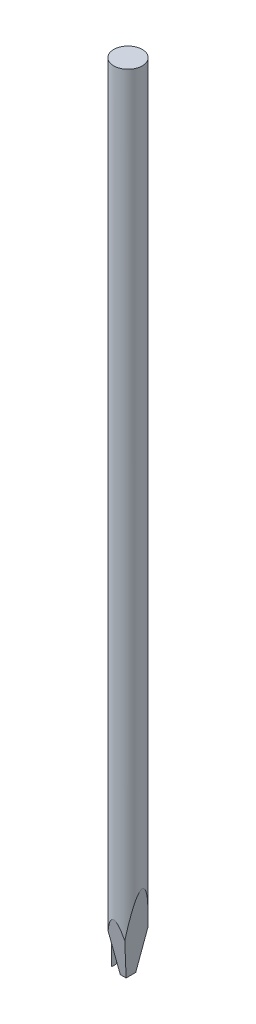
ISO-10303-21;
HEADER;
FILE_DESCRIPTION(('STEP AP214'),'2;1');
FILE_NAME('part.step','',(''),(''),'','','');
FILE_SCHEMA(('AUTOMOTIVE_DESIGN { 1 0 10303 214 1 1 1 1 }'));
ENDSEC;
DATA;
#1=APPLICATION_CONTEXT('core data for automotive mechanical design processes');
#2=APPLICATION_PROTOCOL_DEFINITION('international standard','automotive_design',2000,#1);
#3=PRODUCT_CONTEXT('',#1,'mechanical');
#4=PRODUCT('Part','Part','',(#3));
#5=PRODUCT_RELATED_PRODUCT_CATEGORY('part','',(#4));
#6=PRODUCT_DEFINITION_FORMATION('','',#4);
#7=PRODUCT_DEFINITION_CONTEXT('part definition',#1,'design');
#8=PRODUCT_DEFINITION('design','',#6,#7);
#9=PRODUCT_DEFINITION_SHAPE('','',#8);
#10=(LENGTH_UNIT() NAMED_UNIT(*) SI_UNIT(.MILLI.,.METRE.));
#11=(NAMED_UNIT(*) PLANE_ANGLE_UNIT() SI_UNIT($,.RADIAN.));
#12=(NAMED_UNIT(*) SI_UNIT($,.STERADIAN.) SOLID_ANGLE_UNIT());
#13=UNCERTAINTY_MEASURE_WITH_UNIT(LENGTH_MEASURE(1.E-05),#10,'distance_accuracy_value','');
#14=(GEOMETRIC_REPRESENTATION_CONTEXT(3) GLOBAL_UNCERTAINTY_ASSIGNED_CONTEXT((#13)) GLOBAL_UNIT_ASSIGNED_CONTEXT((#10,
#11,#12)) REPRESENTATION_CONTEXT('',''));
#15=CARTESIAN_POINT('',(0.,0.,0.));
#16=DIRECTION('',(0.,0.,1.));
#17=DIRECTION('',(1.,0.,0.));
#18=AXIS2_PLACEMENT_3D('',#15,#16,#17);
#19=CARTESIAN_POINT('',(0.,75.9968,0.));
#20=DIRECTION('',(0.,-1.,0.));
#21=DIRECTION('',(0.,0.,-1.));
#22=AXIS2_PLACEMENT_3D('',#19,#20,#21);
#23=CYLINDRICAL_SURFACE('',#22,1.35001);
#24=CARTESIAN_POINT('',(0.,75.9968,0.));
#25=DIRECTION('',(0.,1.,0.));
#26=DIRECTION('',(0.,0.,1.));
#27=AXIS2_PLACEMENT_3D('',#24,#25,#26);
#28=CIRCLE('',#27,1.35001);
#29=CARTESIAN_POINT('',(0.,75.9968,1.35001));
#30=VERTEX_POINT('',#29);
#31=EDGE_CURVE('E109',#30,#30,#28,.T.);
#32=ORIENTED_EDGE('',*,*,#31,.F.);
#33=EDGE_LOOP('',(#32));
#34=FACE_BOUND('',#33,.T.);
#35=CARTESIAN_POINT('',(0.,0.879000020000006,0.));
#36=DIRECTION('',(0.,-1.,0.));
#37=DIRECTION('',(1.,0.,0.));
#38=AXIS2_PLACEMENT_3D('',#35,#36,#37);
#39=CIRCLE('',#38,1.35001);
#40=CARTESIAN_POINT('',(-1.32842,0.87900002,0.240473083109109));
#41=VERTEX_POINT('',#40);
#42=CARTESIAN_POINT('',(-1.32842,0.87900002,-0.240473083109109));
#43=VERTEX_POINT('',#42);
#44=EDGE_CURVE('E11',#41,#43,#39,.T.);
#45=ORIENTED_EDGE('',*,*,#44,.F.);
#46=DIRECTION('',(0.,-1.,0.));
#47=VECTOR('',#46,1.);
#48=CARTESIAN_POINT('',(-1.32842,75.9968,0.240473083109109));
#49=LINE('',#48,#47);
#50=CARTESIAN_POINT('',(-1.32842,8.36957730255488,0.240473083109109));
#51=VERTEX_POINT('',#50);
#52=EDGE_CURVE('E48',#51,#41,#49,.T.);
#53=ORIENTED_EDGE('',*,*,#52,.F.);
#54=CARTESIAN_POINT('',(0.,-1.0826221440547,0.));
#55=DIRECTION('',(-0.99026806874157,-0.139173100960066,0.));
#56=DIRECTION('',(0.139173100960066,-0.99026806874157,0.));
#57=AXIS2_PLACEMENT_3D('',#54,#55,#56);
#58=ELLIPSE('',#57,9.70022217430774,1.35001);
#59=CARTESIAN_POINT('',(-0.787337652322436,4.51957634857339,1.09664325162534));
#60=VERTEX_POINT('',#59);
#61=EDGE_CURVE('E130',#60,#51,#58,.T.);
#62=ORIENTED_EDGE('',*,*,#61,.F.);
#63=CARTESIAN_POINT('',(0.,-1.6997965869758,0.));
#64=DIRECTION('',(0.,-0.173648177666931,0.984807753012208));
#65=DIRECTION('',(0.,-0.984807753012208,-0.173648177666931));
#66=AXIS2_PLACEMENT_3D('',#63,#64,#65);
#67=ELLIPSE('',#66,7.77439773994869,1.35001);
#68=CARTESIAN_POINT('',(0.788952266006151,4.51299188279719,1.09548223265544));
#69=VERTEX_POINT('',#68);
#70=EDGE_CURVE('E63',#69,#60,#67,.T.);
#71=ORIENTED_EDGE('',*,*,#70,.F.);
#72=CARTESIAN_POINT('',(0.,-1.10069518314969,0.));
#73=DIRECTION('',(0.990268068741571,-0.139173100960058,0.));
#74=DIRECTION('',(-0.139173100960058,-0.990268068741571,0.));
#75=AXIS2_PLACEMENT_3D('',#72,#73,#74);
#76=ELLIPSE('',#75,9.70022217430826,1.35001);
#77=CARTESIAN_POINT('',(0.788952266006151,4.51299188279719,-1.09548223265544));
#78=VERTEX_POINT('',#77);
#79=EDGE_CURVE('E123',#78,#69,#76,.T.);
#80=ORIENTED_EDGE('',*,*,#79,.F.);
#81=CARTESIAN_POINT('',(0.,-1.6997965869758,0.));
#82=DIRECTION('',(0.,-0.173648177666931,-0.984807753012208));
#83=DIRECTION('',(0.,-0.984807753012208,0.173648177666931));
#84=AXIS2_PLACEMENT_3D('',#81,#82,#83);
#85=ELLIPSE('',#84,7.77439773994869,1.35001);
#86=CARTESIAN_POINT('',(-0.787337652322436,4.51957634857339,-1.09664325162534));
#87=VERTEX_POINT('',#86);
#88=EDGE_CURVE('E126',#87,#78,#85,.T.);
#89=ORIENTED_EDGE('',*,*,#88,.F.);
#90=CARTESIAN_POINT('',(-1.32842,8.36957730255488,-0.240473083109109));
#91=VERTEX_POINT('',#90);
#92=EDGE_CURVE('E128',#91,#87,#58,.T.);
#93=ORIENTED_EDGE('',*,*,#92,.F.);
#94=DIRECTION('',(0.,-1.,0.));
#95=VECTOR('',#94,1.);
#96=CARTESIAN_POINT('',(-1.32842,75.9968,-0.240473083109109));
#97=LINE('',#96,#95);
#98=EDGE_CURVE('E131',#43,#91,#97,.F.);
#99=ORIENTED_EDGE('',*,*,#98,.F.);
#100=EDGE_LOOP('',(#45,#53,#62,#71,#80,#89,#93,#99));
#101=FACE_BOUND('',#100,.T.);
#102=ADVANCED_FACE('F41',(#34,#101),#23,.T.);
#103=CARTESIAN_POINT('',(0.,75.9968,0.));
#104=DIRECTION('',(0.,1.,0.));
#105=DIRECTION('',(0.,0.,1.));
#106=AXIS2_PLACEMENT_3D('',#103,#104,#105);
#107=PLANE('',#106);
#108=ORIENTED_EDGE('',*,*,#31,.T.);
#109=EDGE_LOOP('',(#108));
#110=FACE_BOUND('',#109,.T.);
#111=ADVANCED_FACE('F163',(#110),#107,.T.);
#112=CARTESIAN_POINT('',(1.36000998,0.,-0.29972));
#113=DIRECTION('',(0.,-0.173648177666931,-0.984807753012208));
#114=DIRECTION('',(0.,0.984807753012208,-0.173648177666931));
#115=AXIS2_PLACEMENT_3D('',#112,#113,#114);
#116=PLANE('',#115);
#117=ORIENTED_EDGE('',*,*,#88,.T.);
#118=DIRECTION('',(-0.137098791054058,-0.975508586841574,0.172008483772957));
#119=VECTOR('',#118,1.);
#120=CARTESIAN_POINT('',(0.177347859522844,0.161200406828878,-0.328143981025112));
#121=LINE('',#120,#119);
#122=CARTESIAN_POINT('',(0.278228016306962,0.87900002,-0.454711419569281));
#123=VERTEX_POINT('',#122);
#124=EDGE_CURVE('E55',#78,#123,#121,.T.);
#125=ORIENTED_EDGE('',*,*,#124,.T.);
#126=DIRECTION('',(-1.,0.,0.));
#127=VECTOR('',#126,1.);
#128=CARTESIAN_POINT('',(1.36000998,0.87900002,-0.454711419569281));
#129=LINE('',#128,#127);
#130=CARTESIAN_POINT('',(-0.275688016306963,0.87900002,-0.454711419569281));
#131=VERTEX_POINT('',#130);
#132=EDGE_CURVE('E114',#123,#131,#129,.T.);
#133=ORIENTED_EDGE('',*,*,#132,.T.);
#134=DIRECTION('',(-0.137098791054065,0.975508586841573,-0.172008483772957));
#135=VECTOR('',#134,1.);
#136=CARTESIAN_POINT('',(-0.123729892849442,-0.202238210719958,-0.264059946919867));
#137=LINE('',#136,#135);
#138=EDGE_CURVE('E99',#131,#87,#137,.T.);
#139=ORIENTED_EDGE('',*,*,#138,.T.);
#140=EDGE_LOOP('',(#117,#125,#133,#139));
#141=FACE_BOUND('',#140,.T.);
#142=ADVANCED_FACE('F150',(#141),#116,.T.);
#143=CARTESIAN_POINT('',(1.36000998,0.,0.29972));
#144=DIRECTION('',(0.,-0.173648177666931,0.984807753012208));
#145=DIRECTION('',(0.,-0.984807753012208,-0.173648177666931));
#146=AXIS2_PLACEMENT_3D('',#143,#144,#145);
#147=PLANE('',#146);
#148=ORIENTED_EDGE('',*,*,#70,.T.);
#149=DIRECTION('',(0.137098791054065,-0.975508586841573,-0.172008483772957));
#150=VECTOR('',#149,1.);
#151=CARTESIAN_POINT('',(-0.123729892849442,-0.202238210719958,0.264059946919867));
#152=LINE('',#151,#150);
#153=CARTESIAN_POINT('',(-0.275688016306963,0.87900002,0.454711419569281));
#154=VERTEX_POINT('',#153);
#155=EDGE_CURVE('E91',#60,#154,#152,.T.);
#156=ORIENTED_EDGE('',*,*,#155,.T.);
#157=DIRECTION('',(1.,0.,0.));
#158=VECTOR('',#157,1.);
#159=CARTESIAN_POINT('',(1.36000998,0.87900002,0.454711419569281));
#160=LINE('',#159,#158);
#161=CARTESIAN_POINT('',(0.278228016306962,0.87900002,0.454711419569281));
#162=VERTEX_POINT('',#161);
#163=EDGE_CURVE('E95',#154,#162,#160,.T.);
#164=ORIENTED_EDGE('',*,*,#163,.T.);
#165=DIRECTION('',(0.137098791054058,0.975508586841574,0.172008483772957));
#166=VECTOR('',#165,1.);
#167=CARTESIAN_POINT('',(0.177347859522844,0.161200406828878,0.328143981025112));
#168=LINE('',#167,#166);
#169=EDGE_CURVE('E146',#162,#69,#168,.T.);
#170=ORIENTED_EDGE('',*,*,#169,.T.);
#171=EDGE_LOOP('',(#148,#156,#164,#170));
#172=FACE_BOUND('',#171,.T.);
#173=ADVANCED_FACE('F93',(#172),#147,.T.);
#174=CARTESIAN_POINT('',(0.69977,0.87900002,1.36000998));
#175=DIRECTION('',(0.,-1.,0.));
#176=DIRECTION('',(1.,0.,0.));
#177=AXIS2_PLACEMENT_3D('',#174,#175,#176);
#178=PLANE('',#177);
#179=ORIENTED_EDGE('',*,*,#44,.T.);
#180=DIRECTION('',(0.,0.,1.));
#181=VECTOR('',#180,1.);
#182=CARTESIAN_POINT('',(-1.32842,0.87900002,1.36000998));
#183=LINE('',#182,#181);
#184=EDGE_CURVE('E110',#43,#41,#183,.T.);
#185=ORIENTED_EDGE('',*,*,#184,.T.);
#186=EDGE_LOOP('',(#179,#185));
#187=FACE_BOUND('',#186,.T.);
#188=ADVANCED_FACE('F142',(#187),#178,.T.);
#189=CARTESIAN_POINT('',(-0.26924,0.83312,1.36000998));
#190=DIRECTION('',(-0.99026806874157,-0.139173100960066,0.));
#191=DIRECTION('',(0.139173100960066,-0.99026806874157,0.));
#192=AXIS2_PLACEMENT_3D('',#189,#190,#191);
#193=PLANE('',#192);
#194=ORIENTED_EDGE('',*,*,#61,.T.);
#195=DIRECTION('',(0.,0.,-1.));
#196=VECTOR('',#195,1.);
#197=CARTESIAN_POINT('',(-1.32842,8.36957730255488,1.36000998));
#198=LINE('',#197,#196);
#199=EDGE_CURVE('E100',#51,#91,#198,.T.);
#200=ORIENTED_EDGE('',*,*,#199,.T.);
#201=ORIENTED_EDGE('',*,*,#92,.T.);
#202=ORIENTED_EDGE('',*,*,#138,.F.);
#203=DIRECTION('',(0.,0.,-1.));
#204=VECTOR('',#203,1.);
#205=CARTESIAN_POINT('',(-0.275688016306963,0.87900002,1.36000998));
#206=LINE('',#205,#204);
#207=EDGE_CURVE('E104',#154,#131,#206,.T.);
#208=ORIENTED_EDGE('',*,*,#207,.F.);
#209=ORIENTED_EDGE('',*,*,#155,.F.);
#210=EDGE_LOOP('',(#194,#200,#201,#202,#208,#209));
#211=FACE_BOUND('',#210,.T.);
#212=ADVANCED_FACE('F105',(#211),#193,.T.);
#213=CARTESIAN_POINT('',(-1.32842,-0.00999998,1.36000998));
#214=DIRECTION('',(1.,0.,0.));
#215=DIRECTION('',(0.,0.,-1.));
#216=AXIS2_PLACEMENT_3D('',#213,#214,#215);
#217=PLANE('',#216);
#218=ORIENTED_EDGE('',*,*,#52,.T.);
#219=ORIENTED_EDGE('',*,*,#184,.F.);
#220=ORIENTED_EDGE('',*,*,#98,.T.);
#221=ORIENTED_EDGE('',*,*,#199,.F.);
#222=EDGE_LOOP('',(#218,#219,#220,#221));
#223=FACE_BOUND('',#222,.T.);
#224=ADVANCED_FACE('F136',(#223),#217,.T.);
#225=CARTESIAN_POINT('',(0.27178,0.83312,1.36000998));
#226=DIRECTION('',(0.990268068741571,-0.139173100960058,0.));
#227=DIRECTION('',(0.139173100960058,0.990268068741571,0.));
#228=AXIS2_PLACEMENT_3D('',#225,#226,#227);
#229=PLANE('',#228);
#230=ORIENTED_EDGE('',*,*,#79,.T.);
#231=ORIENTED_EDGE('',*,*,#169,.F.);
#232=DIRECTION('',(0.,0.,1.));
#233=VECTOR('',#232,1.);
#234=CARTESIAN_POINT('',(0.278228016306962,0.87900002,1.36000998));
#235=LINE('',#234,#233);
#236=EDGE_CURVE('E113',#123,#162,#235,.T.);
#237=ORIENTED_EDGE('',*,*,#236,.F.);
#238=ORIENTED_EDGE('',*,*,#124,.F.);
#239=EDGE_LOOP('',(#230,#231,#237,#238));
#240=FACE_BOUND('',#239,.T.);
#241=ADVANCED_FACE('F152',(#240),#229,.T.);
#242=ORIENTED_EDGE('',*,*,#236,.T.);
#243=ORIENTED_EDGE('',*,*,#163,.F.);
#244=ORIENTED_EDGE('',*,*,#207,.T.);
#245=ORIENTED_EDGE('',*,*,#132,.F.);
#246=EDGE_LOOP('',(#242,#243,#244,#245));
#247=FACE_BOUND('',#246,.T.);
#248=ADVANCED_FACE('F112',(#247),#178,.T.);
#249=CLOSED_SHELL('',(#102,#111,#142,#173,#188,#212,#224,#241,#248));
#250=MANIFOLD_SOLID_BREP('B2',#249);
#251=ADVANCED_BREP_SHAPE_REPRESENTATION('',(#18,#250),#14);
#252=SHAPE_DEFINITION_REPRESENTATION(#9,#251);
ENDSEC;
END-ISO-10303-21;
